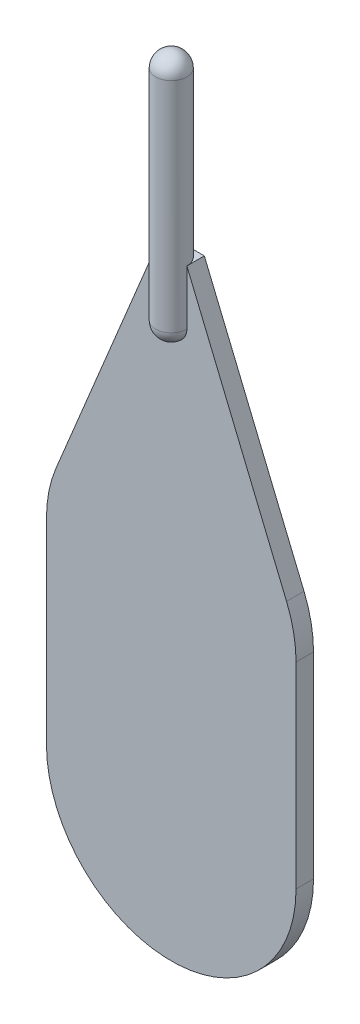
ISO-10303-21;
HEADER;
FILE_DESCRIPTION(('STEP AP214'),'2;1');
FILE_NAME('part.step','',(''),(''),'','','');
FILE_SCHEMA(('AUTOMOTIVE_DESIGN { 1 0 10303 214 1 1 1 1 }'));
ENDSEC;
DATA;
#1=APPLICATION_CONTEXT('core data for automotive mechanical design processes');
#2=APPLICATION_PROTOCOL_DEFINITION('international standard','automotive_design',2000,#1);
#3=PRODUCT_CONTEXT('',#1,'mechanical');
#4=PRODUCT('Part','Part','',(#3));
#5=PRODUCT_RELATED_PRODUCT_CATEGORY('part','',(#4));
#6=PRODUCT_DEFINITION_FORMATION('','',#4);
#7=PRODUCT_DEFINITION_CONTEXT('part definition',#1,'design');
#8=PRODUCT_DEFINITION('design','',#6,#7);
#9=PRODUCT_DEFINITION_SHAPE('','',#8);
#10=(LENGTH_UNIT() NAMED_UNIT(*) SI_UNIT(.MILLI.,.METRE.));
#11=(NAMED_UNIT(*) PLANE_ANGLE_UNIT() SI_UNIT($,.RADIAN.));
#12=(NAMED_UNIT(*) SI_UNIT($,.STERADIAN.) SOLID_ANGLE_UNIT());
#13=UNCERTAINTY_MEASURE_WITH_UNIT(LENGTH_MEASURE(1.E-05),#10,'distance_accuracy_value','');
#14=(GEOMETRIC_REPRESENTATION_CONTEXT(3) GLOBAL_UNCERTAINTY_ASSIGNED_CONTEXT((#13)) GLOBAL_UNIT_ASSIGNED_CONTEXT((#10,
#11,#12)) REPRESENTATION_CONTEXT('',''));
#15=CARTESIAN_POINT('',(0.,0.,0.));
#16=DIRECTION('',(0.,0.,1.));
#17=DIRECTION('',(1.,0.,0.));
#18=AXIS2_PLACEMENT_3D('',#15,#16,#17);
#19=CARTESIAN_POINT('',(22.0396725551687,13.0759085074889,0.889));
#20=DIRECTION('',(0.,0.,1.));
#21=DIRECTION('',(1.,0.,0.));
#22=AXIS2_PLACEMENT_3D('',#19,#20,#21);
#23=PLANE('',#22);
#24=CARTESIAN_POINT('',(22.0396725551687,24.967543785082,0.889));
#25=DIRECTION('',(0.,0.,1.));
#26=DIRECTION('',(1.,0.,0.));
#27=AXIS2_PLACEMENT_3D('',#24,#25,#26);
#28=CIRCLE('',#27,0.793749999999996);
#29=CARTESIAN_POINT('',(22.8334225551687,24.967543785082,0.889));
#30=VERTEX_POINT('',#29);
#31=CARTESIAN_POINT('',(21.2459225551687,24.967543785082,0.889));
#32=VERTEX_POINT('',#31);
#33=EDGE_CURVE('E52',#30,#32,#28,.F.);
#34=ORIENTED_EDGE('',*,*,#33,.T.);
#35=DIRECTION('',(0.,-1.,0.));
#36=VECTOR('',#35,1.);
#37=CARTESIAN_POINT('',(21.2459225551687,24.173793785082,0.889));
#38=LINE('',#37,#36);
#39=CARTESIAN_POINT('',(21.2459225551687,27.7529761462855,0.889));
#40=VERTEX_POINT('',#39);
#41=EDGE_CURVE('E11',#32,#40,#38,.F.);
#42=ORIENTED_EDGE('',*,*,#41,.T.);
#43=DIRECTION('',(-0.382683432365083,-0.92387953251129,0.));
#44=VECTOR('',#43,1.);
#45=CARTESIAN_POINT('',(21.2459225551687,27.7529761462855,0.889));
#46=LINE('',#45,#44);
#47=CARTESIAN_POINT('',(16.173037523722,15.5059483030072,0.889));
#48=VERTEX_POINT('',#47);
#49=EDGE_CURVE('E67',#40,#48,#46,.T.);
#50=ORIENTED_EDGE('',*,*,#49,.T.);
#51=CARTESIAN_POINT('',(22.0396725551687,13.0759085074889,0.889));
#52=DIRECTION('',(0.,0.,1.));
#53=DIRECTION('',(1.,0.,0.));
#54=AXIS2_PLACEMENT_3D('',#51,#52,#53);
#55=CIRCLE('',#54,6.35);
#56=CARTESIAN_POINT('',(15.6896725551687,13.0759085074889,0.889));
#57=VERTEX_POINT('',#56);
#58=EDGE_CURVE('E181',#48,#57,#55,.T.);
#59=ORIENTED_EDGE('',*,*,#58,.T.);
#60=DIRECTION('',(0.,-1.,0.));
#61=VECTOR('',#60,1.);
#62=CARTESIAN_POINT('',(15.6896725551687,3.0759085074889,0.889));
#63=LINE('',#62,#61);
#64=CARTESIAN_POINT('',(15.6896725551687,3.0759085074889,0.889));
#65=VERTEX_POINT('',#64);
#66=EDGE_CURVE('E110',#57,#65,#63,.T.);
#67=ORIENTED_EDGE('',*,*,#66,.T.);
#68=CARTESIAN_POINT('',(22.0396725551687,3.0759085074889,0.889));
#69=DIRECTION('',(0.,0.,1.));
#70=DIRECTION('',(1.,0.,0.));
#71=AXIS2_PLACEMENT_3D('',#68,#69,#70);
#72=CIRCLE('',#71,6.35000000000001);
#73=CARTESIAN_POINT('',(28.3896725551687,3.0759085074889,0.889));
#74=VERTEX_POINT('',#73);
#75=EDGE_CURVE('E127',#65,#74,#72,.T.);
#76=ORIENTED_EDGE('',*,*,#75,.T.);
#77=DIRECTION('',(0.,1.,0.));
#78=VECTOR('',#77,1.);
#79=CARTESIAN_POINT('',(28.3896725551687,3.0759085074889,0.889));
#80=LINE('',#79,#78);
#81=CARTESIAN_POINT('',(28.3896725551688,13.0759085074889,0.889));
#82=VERTEX_POINT('',#81);
#83=EDGE_CURVE('E119',#74,#82,#80,.T.);
#84=ORIENTED_EDGE('',*,*,#83,.T.);
#85=CARTESIAN_POINT('',(22.0396725551687,13.0759085074889,0.889));
#86=DIRECTION('',(0.,0.,1.));
#87=DIRECTION('',(1.,0.,0.));
#88=AXIS2_PLACEMENT_3D('',#85,#86,#87);
#89=CIRCLE('',#88,6.35000000000003);
#90=CARTESIAN_POINT('',(27.9063075866154,15.5059483030072,0.889));
#91=VERTEX_POINT('',#90);
#92=EDGE_CURVE('E124',#82,#91,#89,.T.);
#93=ORIENTED_EDGE('',*,*,#92,.T.);
#94=DIRECTION('',(-0.382683432365085,0.923879532511289,0.));
#95=VECTOR('',#94,1.);
#96=CARTESIAN_POINT('',(22.8334225551687,27.7529761462855,0.889));
#97=LINE('',#96,#95);
#98=CARTESIAN_POINT('',(22.8334225551687,27.7529761462855,0.889));
#99=VERTEX_POINT('',#98);
#100=EDGE_CURVE('E148',#91,#99,#97,.T.);
#101=ORIENTED_EDGE('',*,*,#100,.T.);
#102=DIRECTION('',(0.,-1.,0.));
#103=VECTOR('',#102,1.);
#104=CARTESIAN_POINT('',(22.8334225551687,24.173793785082,0.889));
#105=LINE('',#104,#103);
#106=EDGE_CURVE('E202',#99,#30,#105,.T.);
#107=ORIENTED_EDGE('',*,*,#106,.T.);
#108=EDGE_LOOP('',(#34,#42,#50,#59,#67,#76,#84,#93,#101,#107));
#109=FACE_BOUND('',#108,.T.);
#110=ADVANCED_FACE('F43',(#109),#23,.T.);
#111=CARTESIAN_POINT('',(22.0396725551687,13.0759085074889,0.889));
#112=DIRECTION('',(0.,0.,-1.));
#113=DIRECTION('',(-1.,0.,0.));
#114=AXIS2_PLACEMENT_3D('',#111,#112,#113);
#115=CYLINDRICAL_SURFACE('',#114,6.35);
#116=CARTESIAN_POINT('',(22.0396725551687,13.0759085074889,0.));
#117=DIRECTION('',(0.,0.,1.));
#118=DIRECTION('',(1.,0.,0.));
#119=AXIS2_PLACEMENT_3D('',#116,#117,#118);
#120=CIRCLE('',#119,6.35);
#121=CARTESIAN_POINT('',(16.173037523722,15.5059483030072,0.));
#122=VERTEX_POINT('',#121);
#123=CARTESIAN_POINT('',(15.6896725551687,13.0759085074889,0.));
#124=VERTEX_POINT('',#123);
#125=EDGE_CURVE('E157',#122,#124,#120,.T.);
#126=ORIENTED_EDGE('',*,*,#125,.T.);
#127=DIRECTION('',(0.,0.,-1.));
#128=VECTOR('',#127,1.);
#129=CARTESIAN_POINT('',(15.6896725551687,13.0759085074889,0.889));
#130=LINE('',#129,#128);
#131=EDGE_CURVE('E199',#57,#124,#130,.T.);
#132=ORIENTED_EDGE('',*,*,#131,.F.);
#133=ORIENTED_EDGE('',*,*,#58,.F.);
#134=DIRECTION('',(0.,0.,-1.));
#135=VECTOR('',#134,1.);
#136=CARTESIAN_POINT('',(16.173037523722,15.5059483030072,0.889));
#137=LINE('',#136,#135);
#138=EDGE_CURVE('E156',#48,#122,#137,.T.);
#139=ORIENTED_EDGE('',*,*,#138,.T.);
#140=EDGE_LOOP('',(#126,#132,#133,#139));
#141=FACE_BOUND('',#140,.T.);
#142=ADVANCED_FACE('F45',(#141),#115,.T.);
#143=CARTESIAN_POINT('',(15.6896725551687,3.0759085074889,0.889));
#144=DIRECTION('',(1.,0.,0.));
#145=DIRECTION('',(0.,0.,-1.));
#146=AXIS2_PLACEMENT_3D('',#143,#144,#145);
#147=PLANE('',#146);
#148=DIRECTION('',(0.,-1.,0.));
#149=VECTOR('',#148,1.);
#150=CARTESIAN_POINT('',(15.6896725551687,3.0759085074889,0.));
#151=LINE('',#150,#149);
#152=CARTESIAN_POINT('',(15.6896725551687,3.0759085074889,0.));
#153=VERTEX_POINT('',#152);
#154=EDGE_CURVE('E161',#124,#153,#151,.T.);
#155=ORIENTED_EDGE('',*,*,#154,.T.);
#156=DIRECTION('',(0.,0.,-1.));
#157=VECTOR('',#156,1.);
#158=CARTESIAN_POINT('',(15.6896725551687,3.0759085074889,0.889));
#159=LINE('',#158,#157);
#160=EDGE_CURVE('E195',#65,#153,#159,.T.);
#161=ORIENTED_EDGE('',*,*,#160,.F.);
#162=ORIENTED_EDGE('',*,*,#66,.F.);
#163=ORIENTED_EDGE('',*,*,#131,.T.);
#164=EDGE_LOOP('',(#155,#161,#162,#163));
#165=FACE_BOUND('',#164,.T.);
#166=ADVANCED_FACE('F228',(#165),#147,.F.);
#167=CARTESIAN_POINT('',(22.0396725551687,3.0759085074889,0.889));
#168=DIRECTION('',(0.,0.,-1.));
#169=DIRECTION('',(-1.,0.,0.));
#170=AXIS2_PLACEMENT_3D('',#167,#168,#169);
#171=CYLINDRICAL_SURFACE('',#170,6.35000000000001);
#172=CARTESIAN_POINT('',(22.0396725551687,3.0759085074889,0.));
#173=DIRECTION('',(0.,0.,1.));
#174=DIRECTION('',(1.,0.,0.));
#175=AXIS2_PLACEMENT_3D('',#172,#173,#174);
#176=CIRCLE('',#175,6.35000000000001);
#177=CARTESIAN_POINT('',(28.3896725551687,3.0759085074889,0.));
#178=VERTEX_POINT('',#177);
#179=EDGE_CURVE('E165',#153,#178,#176,.T.);
#180=ORIENTED_EDGE('',*,*,#179,.T.);
#181=DIRECTION('',(0.,0.,-1.));
#182=VECTOR('',#181,1.);
#183=CARTESIAN_POINT('',(28.3896725551687,3.0759085074889,0.889));
#184=LINE('',#183,#182);
#185=EDGE_CURVE('E141',#74,#178,#184,.T.);
#186=ORIENTED_EDGE('',*,*,#185,.F.);
#187=ORIENTED_EDGE('',*,*,#75,.F.);
#188=ORIENTED_EDGE('',*,*,#160,.T.);
#189=EDGE_LOOP('',(#180,#186,#187,#188));
#190=FACE_BOUND('',#189,.T.);
#191=ADVANCED_FACE('F231',(#190),#171,.T.);
#192=CARTESIAN_POINT('',(28.3896725551687,3.0759085074889,0.889));
#193=DIRECTION('',(-1.,0.,0.));
#194=DIRECTION('',(0.,0.,1.));
#195=AXIS2_PLACEMENT_3D('',#192,#193,#194);
#196=PLANE('',#195);
#197=DIRECTION('',(0.,1.,0.));
#198=VECTOR('',#197,1.);
#199=CARTESIAN_POINT('',(28.3896725551687,3.0759085074889,0.));
#200=LINE('',#199,#198);
#201=CARTESIAN_POINT('',(28.3896725551688,13.0759085074889,0.));
#202=VERTEX_POINT('',#201);
#203=EDGE_CURVE('E137',#178,#202,#200,.T.);
#204=ORIENTED_EDGE('',*,*,#203,.T.);
#205=DIRECTION('',(0.,0.,-1.));
#206=VECTOR('',#205,1.);
#207=CARTESIAN_POINT('',(28.3896725551688,13.0759085074889,0.889));
#208=LINE('',#207,#206);
#209=EDGE_CURVE('E134',#82,#202,#208,.T.);
#210=ORIENTED_EDGE('',*,*,#209,.F.);
#211=ORIENTED_EDGE('',*,*,#83,.F.);
#212=ORIENTED_EDGE('',*,*,#185,.T.);
#213=EDGE_LOOP('',(#204,#210,#211,#212));
#214=FACE_BOUND('',#213,.T.);
#215=ADVANCED_FACE('F135',(#214),#196,.F.);
#216=CARTESIAN_POINT('',(22.0396725551687,13.0759085074889,0.889));
#217=DIRECTION('',(0.,0.,-1.));
#218=DIRECTION('',(-1.,0.,0.));
#219=AXIS2_PLACEMENT_3D('',#216,#217,#218);
#220=CYLINDRICAL_SURFACE('',#219,6.35000000000003);
#221=CARTESIAN_POINT('',(22.0396725551687,13.0759085074889,0.));
#222=DIRECTION('',(0.,0.,1.));
#223=DIRECTION('',(1.,0.,0.));
#224=AXIS2_PLACEMENT_3D('',#221,#222,#223);
#225=CIRCLE('',#224,6.35000000000003);
#226=CARTESIAN_POINT('',(27.9063075866154,15.5059483030072,0.));
#227=VERTEX_POINT('',#226);
#228=EDGE_CURVE('E170',#202,#227,#225,.T.);
#229=ORIENTED_EDGE('',*,*,#228,.T.);
#230=DIRECTION('',(0.,0.,-1.));
#231=VECTOR('',#230,1.);
#232=CARTESIAN_POINT('',(27.9063075866154,15.5059483030072,0.889));
#233=LINE('',#232,#231);
#234=EDGE_CURVE('E142',#91,#227,#233,.T.);
#235=ORIENTED_EDGE('',*,*,#234,.F.);
#236=ORIENTED_EDGE('',*,*,#92,.F.);
#237=ORIENTED_EDGE('',*,*,#209,.T.);
#238=EDGE_LOOP('',(#229,#235,#236,#237));
#239=FACE_BOUND('',#238,.T.);
#240=ADVANCED_FACE('F144',(#239),#220,.T.);
#241=CARTESIAN_POINT('',(22.8334225551687,27.7529761462855,0.889));
#242=DIRECTION('',(-0.923879532511289,-0.382683432365085,0.));
#243=DIRECTION('',(0.382683432365085,-0.923879532511289,0.));
#244=AXIS2_PLACEMENT_3D('',#241,#242,#243);
#245=PLANE('',#244);
#246=DIRECTION('',(-0.382683432365085,0.923879532511289,0.));
#247=VECTOR('',#246,1.);
#248=CARTESIAN_POINT('',(22.8334225551687,27.7529761462855,0.));
#249=LINE('',#248,#247);
#250=CARTESIAN_POINT('',(22.8334225551687,27.7529761462855,0.));
#251=VERTEX_POINT('',#250);
#252=EDGE_CURVE('E173',#227,#251,#249,.T.);
#253=ORIENTED_EDGE('',*,*,#252,.T.);
#254=DIRECTION('',(0.,0.,-1.));
#255=VECTOR('',#254,1.);
#256=CARTESIAN_POINT('',(22.8334225551687,27.7529761462855,0.889));
#257=LINE('',#256,#255);
#258=EDGE_CURVE('E187',#99,#251,#257,.T.);
#259=ORIENTED_EDGE('',*,*,#258,.F.);
#260=ORIENTED_EDGE('',*,*,#100,.F.);
#261=ORIENTED_EDGE('',*,*,#234,.T.);
#262=EDGE_LOOP('',(#253,#259,#260,#261));
#263=FACE_BOUND('',#262,.T.);
#264=ADVANCED_FACE('F238',(#263),#245,.F.);
#265=CARTESIAN_POINT('',(22.8334225551687,27.7529761462855,0.889));
#266=DIRECTION('',(0.,-1.,0.));
#267=DIRECTION('',(0.,0.,-1.));
#268=AXIS2_PLACEMENT_3D('',#265,#266,#267);
#269=PLANE('',#268);
#270=CARTESIAN_POINT('',(22.0396725551687,27.7529761462855,0.889));
#271=DIRECTION('',(0.,-1.,0.));
#272=DIRECTION('',(0.,0.,-1.));
#273=AXIS2_PLACEMENT_3D('',#270,#271,#272);
#274=CIRCLE('',#273,0.793749999999996);
#275=EDGE_CURVE('E162',#99,#40,#274,.F.);
#276=ORIENTED_EDGE('',*,*,#275,.F.);
#277=ORIENTED_EDGE('',*,*,#258,.T.);
#278=DIRECTION('',(-1.,0.,0.));
#279=VECTOR('',#278,1.);
#280=CARTESIAN_POINT('',(22.8334225551687,27.7529761462855,0.));
#281=LINE('',#280,#279);
#282=CARTESIAN_POINT('',(21.2459225551687,27.7529761462855,0.));
#283=VERTEX_POINT('',#282);
#284=EDGE_CURVE('E176',#251,#283,#281,.T.);
#285=ORIENTED_EDGE('',*,*,#284,.T.);
#286=DIRECTION('',(0.,0.,-1.));
#287=VECTOR('',#286,1.);
#288=CARTESIAN_POINT('',(21.2459225551687,27.7529761462855,0.889));
#289=LINE('',#288,#287);
#290=EDGE_CURVE('E184',#40,#283,#289,.T.);
#291=ORIENTED_EDGE('',*,*,#290,.F.);
#292=EDGE_LOOP('',(#276,#277,#285,#291));
#293=FACE_BOUND('',#292,.T.);
#294=ADVANCED_FACE('F244',(#293),#269,.F.);
#295=CARTESIAN_POINT('',(21.2459225551687,27.7529761462855,0.889));
#296=DIRECTION('',(0.92387953251129,-0.382683432365083,0.));
#297=DIRECTION('',(0.382683432365083,0.92387953251129,0.));
#298=AXIS2_PLACEMENT_3D('',#295,#296,#297);
#299=PLANE('',#298);
#300=DIRECTION('',(-0.382683432365083,-0.92387953251129,0.));
#301=VECTOR('',#300,1.);
#302=CARTESIAN_POINT('',(21.2459225551687,27.7529761462855,0.));
#303=LINE('',#302,#301);
#304=EDGE_CURVE('E101',#283,#122,#303,.T.);
#305=ORIENTED_EDGE('',*,*,#304,.T.);
#306=ORIENTED_EDGE('',*,*,#138,.F.);
#307=ORIENTED_EDGE('',*,*,#49,.F.);
#308=ORIENTED_EDGE('',*,*,#290,.T.);
#309=EDGE_LOOP('',(#305,#306,#307,#308));
#310=FACE_BOUND('',#309,.T.);
#311=ADVANCED_FACE('F245',(#310),#299,.F.);
#312=CARTESIAN_POINT('',(22.0396725551687,13.0759085074889,0.));
#313=DIRECTION('',(0.,0.,1.));
#314=DIRECTION('',(1.,0.,0.));
#315=AXIS2_PLACEMENT_3D('',#312,#313,#314);
#316=PLANE('',#315);
#317=ORIENTED_EDGE('',*,*,#125,.F.);
#318=ORIENTED_EDGE('',*,*,#304,.F.);
#319=ORIENTED_EDGE('',*,*,#284,.F.);
#320=ORIENTED_EDGE('',*,*,#252,.F.);
#321=ORIENTED_EDGE('',*,*,#228,.F.);
#322=ORIENTED_EDGE('',*,*,#203,.F.);
#323=ORIENTED_EDGE('',*,*,#179,.F.);
#324=ORIENTED_EDGE('',*,*,#154,.F.);
#325=EDGE_LOOP('',(#317,#318,#319,#320,#321,#322,#323,#324));
#326=FACE_BOUND('',#325,.T.);
#327=ADVANCED_FACE('F234',(#326),#316,.F.);
#328=CARTESIAN_POINT('',(22.0396725551687,24.967543785082,0.889));
#329=DIRECTION('',(0.,-1.,0.));
#330=DIRECTION('',(-1.,0.,0.));
#331=AXIS2_PLACEMENT_3D('',#328,#329,#330);
#332=SPHERICAL_SURFACE('',#331,0.793749999999996);
#333=ORIENTED_EDGE('',*,*,#33,.F.);
#334=CARTESIAN_POINT('',(22.0396725551687,24.967543785082,0.889));
#335=DIRECTION('',(0.,-1.,0.));
#336=DIRECTION('',(0.,0.,-1.));
#337=AXIS2_PLACEMENT_3D('',#334,#335,#336);
#338=CIRCLE('',#337,0.793749999999996);
#339=EDGE_CURVE('E59',#30,#32,#338,.T.);
#340=ORIENTED_EDGE('',*,*,#339,.T.);
#341=EDGE_LOOP('',(#333,#340));
#342=FACE_BOUND('',#341,.T.);
#343=ADVANCED_FACE('F211',(#342),#332,.T.);
#344=CARTESIAN_POINT('',(22.0396725551687,24.173793785082,0.889));
#345=DIRECTION('',(0.,-1.,0.));
#346=DIRECTION('',(0.,0.,-1.));
#347=AXIS2_PLACEMENT_3D('',#344,#345,#346);
#348=CYLINDRICAL_SURFACE('',#347,0.793749999999996);
#349=ORIENTED_EDGE('',*,*,#41,.F.);
#350=ORIENTED_EDGE('',*,*,#339,.F.);
#351=ORIENTED_EDGE('',*,*,#106,.F.);
#352=ORIENTED_EDGE('',*,*,#275,.T.);
#353=EDGE_LOOP('',(#349,#350,#351,#352));
#354=FACE_BOUND('',#353,.T.);
#355=CARTESIAN_POINT('',(22.0396725551687,36.080043785082,0.889));
#356=DIRECTION('',(0.,-1.,0.));
#357=DIRECTION('',(0.,0.,-1.));
#358=AXIS2_PLACEMENT_3D('',#355,#356,#357);
#359=CIRCLE('',#358,0.793749999999996);
#360=CARTESIAN_POINT('',(22.0396725551687,36.080043785082,0.0952500000000042));
#361=VERTEX_POINT('',#360);
#362=EDGE_CURVE('E213',#361,#361,#359,.T.);
#363=ORIENTED_EDGE('',*,*,#362,.T.);
#364=EDGE_LOOP('',(#363));
#365=FACE_BOUND('',#364,.T.);
#366=ADVANCED_FACE('F241',(#354,#365),#348,.T.);
#367=CARTESIAN_POINT('',(22.0396725551687,36.080043785082,0.889));
#368=DIRECTION('',(0.,-1.,0.));
#369=DIRECTION('',(-1.,0.,0.));
#370=AXIS2_PLACEMENT_3D('',#367,#368,#369);
#371=SPHERICAL_SURFACE('',#370,0.793749999999996);
#372=ORIENTED_EDGE('',*,*,#362,.F.);
#373=EDGE_LOOP('',(#372));
#374=FACE_BOUND('',#373,.T.);
#375=ADVANCED_FACE('F310',(#374),#371,.T.);
#376=CLOSED_SHELL('',(#110,#142,#166,#191,#215,#240,#264,#294,#311,#327,#343,#366,#375));
#377=MANIFOLD_SOLID_BREP('B2',#376);
#378=ADVANCED_BREP_SHAPE_REPRESENTATION('',(#18,#377),#14);
#379=SHAPE_DEFINITION_REPRESENTATION(#9,#378);
ENDSEC;
END-ISO-10303-21;
